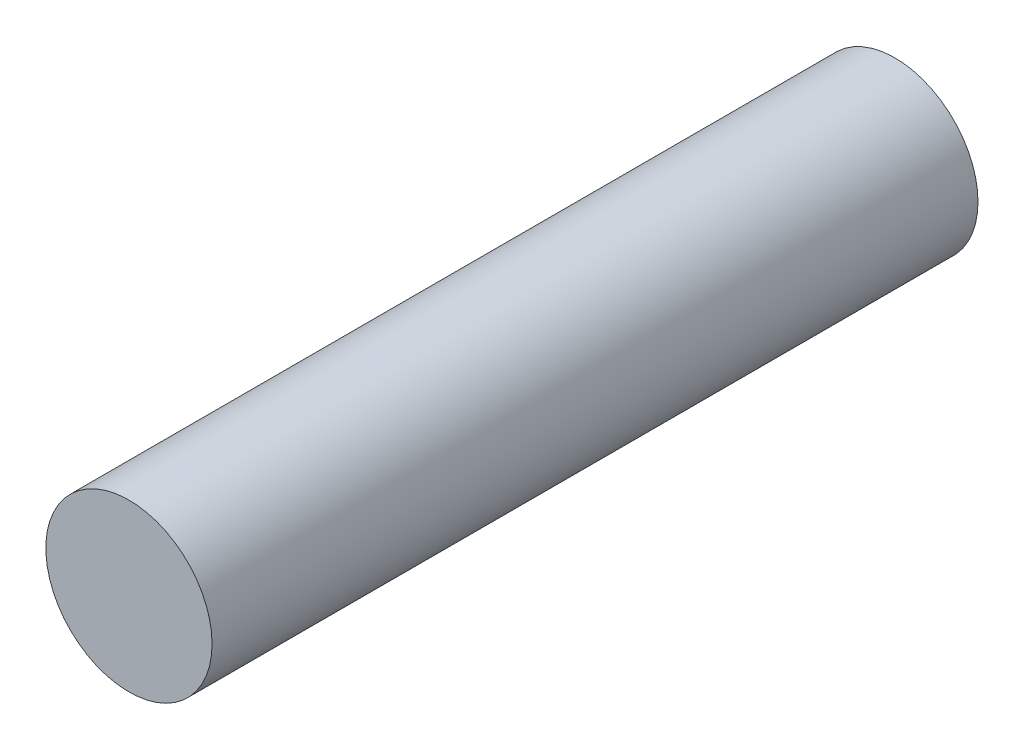
ISO-10303-21;
HEADER;
FILE_DESCRIPTION(('STEP AP214'),'2;1');
FILE_NAME('part.step','',(''),(''),'','','');
FILE_SCHEMA(('AUTOMOTIVE_DESIGN { 1 0 10303 214 1 1 1 1 }'));
ENDSEC;
DATA;
#1=APPLICATION_CONTEXT('core data for automotive mechanical design processes');
#2=APPLICATION_PROTOCOL_DEFINITION('international standard','automotive_design',2000,#1);
#3=PRODUCT_CONTEXT('',#1,'mechanical');
#4=PRODUCT('Part','Part','',(#3));
#5=PRODUCT_RELATED_PRODUCT_CATEGORY('part','',(#4));
#6=PRODUCT_DEFINITION_FORMATION('','',#4);
#7=PRODUCT_DEFINITION_CONTEXT('part definition',#1,'design');
#8=PRODUCT_DEFINITION('design','',#6,#7);
#9=PRODUCT_DEFINITION_SHAPE('','',#8);
#10=(LENGTH_UNIT() NAMED_UNIT(*) SI_UNIT(.MILLI.,.METRE.));
#11=(NAMED_UNIT(*) PLANE_ANGLE_UNIT() SI_UNIT($,.RADIAN.));
#12=(NAMED_UNIT(*) SI_UNIT($,.STERADIAN.) SOLID_ANGLE_UNIT());
#13=UNCERTAINTY_MEASURE_WITH_UNIT(LENGTH_MEASURE(1.E-05),#10,'distance_accuracy_value','');
#14=(GEOMETRIC_REPRESENTATION_CONTEXT(3) GLOBAL_UNCERTAINTY_ASSIGNED_CONTEXT((#13)) GLOBAL_UNIT_ASSIGNED_CONTEXT((#10,
#11,#12)) REPRESENTATION_CONTEXT('',''));
#15=CARTESIAN_POINT('',(0.,0.,0.));
#16=DIRECTION('',(0.,0.,1.));
#17=DIRECTION('',(1.,0.,0.));
#18=AXIS2_PLACEMENT_3D('',#15,#16,#17);
#19=CARTESIAN_POINT('',(0.,0.,18.288));
#20=DIRECTION('',(0.,0.,-1.));
#21=DIRECTION('',(0.,-1.,0.));
#22=AXIS2_PLACEMENT_3D('',#19,#20,#21);
#23=CYLINDRICAL_SURFACE('',#22,3.96875);
#24=CARTESIAN_POINT('',(0.,0.,18.288));
#25=DIRECTION('',(0.,0.,1.));
#26=DIRECTION('',(1.,0.,0.));
#27=AXIS2_PLACEMENT_3D('',#24,#25,#26);
#28=CIRCLE('',#27,3.96875);
#29=CARTESIAN_POINT('',(3.96875,0.,18.288));
#30=VERTEX_POINT('',#29);
#31=EDGE_CURVE('E20',#30,#30,#28,.T.);
#32=ORIENTED_EDGE('',*,*,#31,.F.);
#33=EDGE_LOOP('',(#32));
#34=FACE_BOUND('',#33,.T.);
#35=CARTESIAN_POINT('',(0.,0.,-18.288));
#36=DIRECTION('',(0.,0.,1.));
#37=DIRECTION('',(1.,0.,0.));
#38=AXIS2_PLACEMENT_3D('',#35,#36,#37);
#39=CIRCLE('',#38,3.96875);
#40=CARTESIAN_POINT('',(3.96875,0.,-18.288));
#41=VERTEX_POINT('',#40);
#42=EDGE_CURVE('E9',#41,#41,#39,.T.);
#43=ORIENTED_EDGE('',*,*,#42,.T.);
#44=EDGE_LOOP('',(#43));
#45=FACE_BOUND('',#44,.T.);
#46=ADVANCED_FACE('F14',(#34,#45),#23,.T.);
#47=CARTESIAN_POINT('',(0.,0.,18.288));
#48=DIRECTION('',(0.,0.,1.));
#49=DIRECTION('',(1.,0.,0.));
#50=AXIS2_PLACEMENT_3D('',#47,#48,#49);
#51=PLANE('',#50);
#52=ORIENTED_EDGE('',*,*,#31,.T.);
#53=EDGE_LOOP('',(#52));
#54=FACE_BOUND('',#53,.T.);
#55=ADVANCED_FACE('F26',(#54),#51,.T.);
#56=CARTESIAN_POINT('',(0.,0.,-18.288));
#57=DIRECTION('',(0.,0.,1.));
#58=DIRECTION('',(1.,0.,0.));
#59=AXIS2_PLACEMENT_3D('',#56,#57,#58);
#60=PLANE('',#59);
#61=ORIENTED_EDGE('',*,*,#42,.F.);
#62=EDGE_LOOP('',(#61));
#63=FACE_BOUND('',#62,.T.);
#64=ADVANCED_FACE('F33',(#63),#60,.F.);
#65=CLOSED_SHELL('',(#46,#55,#64));
#66=MANIFOLD_SOLID_BREP('B1',#65);
#67=ADVANCED_BREP_SHAPE_REPRESENTATION('',(#18,#66),#14);
#68=SHAPE_DEFINITION_REPRESENTATION(#9,#67);
ENDSEC;
END-ISO-10303-21;
